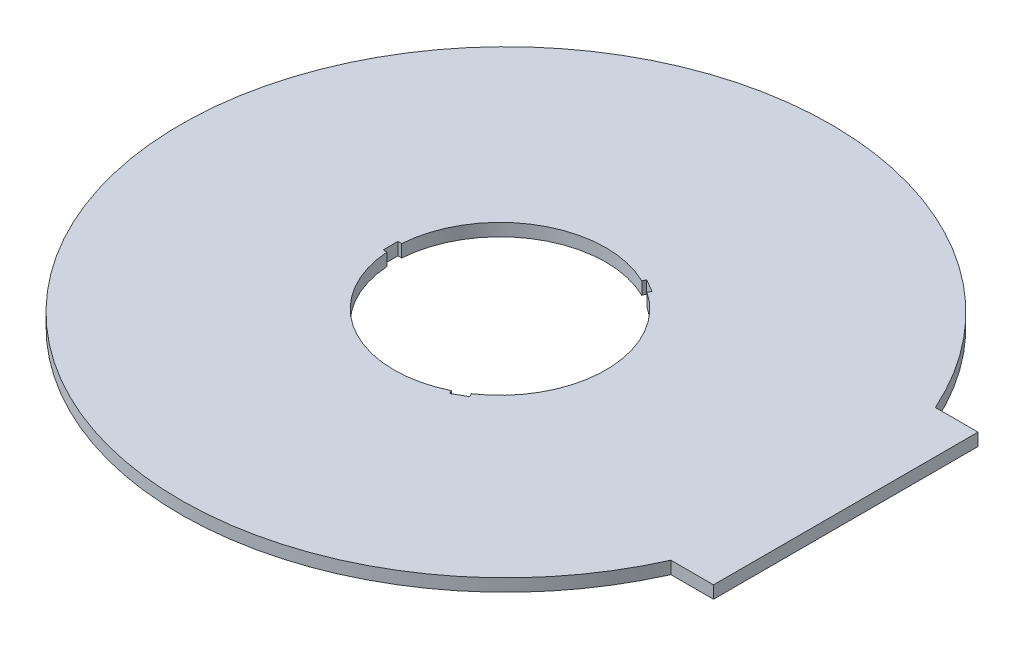
ISO-10303-21;
HEADER;
FILE_DESCRIPTION(('STEP AP214'),'2;1');
FILE_NAME('part.step','',(''),(''),'','','');
FILE_SCHEMA(('AUTOMOTIVE_DESIGN { 1 0 10303 214 1 1 1 1 }'));
ENDSEC;
DATA;
#1=APPLICATION_CONTEXT('core data for automotive mechanical design processes');
#2=APPLICATION_PROTOCOL_DEFINITION('international standard','automotive_design',2000,#1);
#3=PRODUCT_CONTEXT('',#1,'mechanical');
#4=PRODUCT('Part','Part','',(#3));
#5=PRODUCT_RELATED_PRODUCT_CATEGORY('part','',(#4));
#6=PRODUCT_DEFINITION_FORMATION('','',#4);
#7=PRODUCT_DEFINITION_CONTEXT('part definition',#1,'design');
#8=PRODUCT_DEFINITION('design','',#6,#7);
#9=PRODUCT_DEFINITION_SHAPE('','',#8);
#10=(LENGTH_UNIT() NAMED_UNIT(*) SI_UNIT(.MILLI.,.METRE.));
#11=(NAMED_UNIT(*) PLANE_ANGLE_UNIT() SI_UNIT($,.RADIAN.));
#12=(NAMED_UNIT(*) SI_UNIT($,.STERADIAN.) SOLID_ANGLE_UNIT());
#13=UNCERTAINTY_MEASURE_WITH_UNIT(LENGTH_MEASURE(1.E-05),#10,'distance_accuracy_value','');
#14=(GEOMETRIC_REPRESENTATION_CONTEXT(3) GLOBAL_UNCERTAINTY_ASSIGNED_CONTEXT((#13)) GLOBAL_UNIT_ASSIGNED_CONTEXT((#10,
#11,#12)) REPRESENTATION_CONTEXT('',''));
#15=CARTESIAN_POINT('',(0.,0.,0.));
#16=DIRECTION('',(0.,0.,1.));
#17=DIRECTION('',(1.,0.,0.));
#18=AXIS2_PLACEMENT_3D('',#15,#16,#17);
#19=CARTESIAN_POINT('',(116.376935977133,173.473960471824,91.1015697131829));
#20=DIRECTION('',(1.,0.,0.));
#21=DIRECTION('',(0.,0.,-1.));
#22=AXIS2_PLACEMENT_3D('',#19,#20,#21);
#23=PLANE('',#22);
#24=DIRECTION('',(0.,0.,-1.));
#25=VECTOR('',#24,1.);
#26=CARTESIAN_POINT('',(116.376935977133,174.999,91.1015697131829));
#27=LINE('',#26,#25);
#28=CARTESIAN_POINT('',(116.376935977133,174.999,91.1015697131829));
#29=VERTEX_POINT('',#28);
#30=CARTESIAN_POINT('',(116.376935977133,174.999,58.8984302868171));
#31=VERTEX_POINT('',#30);
#32=EDGE_CURVE('E266',#29,#31,#27,.T.);
#33=ORIENTED_EDGE('',*,*,#32,.F.);
#34=DIRECTION('',(0.,1.,0.));
#35=VECTOR('',#34,1.);
#36=CARTESIAN_POINT('',(116.376935977133,173.473960471824,91.1015697131829));
#37=LINE('',#36,#35);
#38=CARTESIAN_POINT('',(116.376935977133,173.473960471824,91.1015697131829));
#39=VERTEX_POINT('',#38);
#40=EDGE_CURVE('E35',#39,#29,#37,.T.);
#41=ORIENTED_EDGE('',*,*,#40,.F.);
#42=DIRECTION('',(0.,0.,-1.));
#43=VECTOR('',#42,1.);
#44=CARTESIAN_POINT('',(116.376935977133,173.473960471824,91.1015697131829));
#45=LINE('',#44,#43);
#46=CARTESIAN_POINT('',(116.376935977133,173.473960471824,58.8984302868171));
#47=VERTEX_POINT('',#46);
#48=EDGE_CURVE('E335',#39,#47,#45,.T.);
#49=ORIENTED_EDGE('',*,*,#48,.T.);
#50=DIRECTION('',(0.,1.,0.));
#51=VECTOR('',#50,1.);
#52=CARTESIAN_POINT('',(116.376935977133,173.473960471824,58.8984302868171));
#53=LINE('',#52,#51);
#54=EDGE_CURVE('E10',#47,#31,#53,.T.);
#55=ORIENTED_EDGE('',*,*,#54,.T.);
#56=EDGE_LOOP('',(#33,#41,#49,#55));
#57=FACE_BOUND('',#56,.T.);
#58=ADVANCED_FACE('F16',(#57),#23,.T.);
#59=CARTESIAN_POINT('',(116.376935977133,173.473960471824,58.8984302868171));
#60=DIRECTION('',(0.,0.,-1.));
#61=DIRECTION('',(-1.,0.,0.));
#62=AXIS2_PLACEMENT_3D('',#59,#60,#61);
#63=PLANE('',#62);
#64=DIRECTION('',(-1.,0.,0.));
#65=VECTOR('',#64,1.);
#66=CARTESIAN_POINT('',(116.376935977133,174.999,58.8984302868171));
#67=LINE('',#66,#65);
#68=CARTESIAN_POINT('',(111.187798908326,174.999,58.8984302868171));
#69=VERTEX_POINT('',#68);
#70=EDGE_CURVE('E269',#31,#69,#67,.T.);
#71=ORIENTED_EDGE('',*,*,#70,.F.);
#72=ORIENTED_EDGE('',*,*,#54,.F.);
#73=DIRECTION('',(-1.,0.,0.));
#74=VECTOR('',#73,1.);
#75=CARTESIAN_POINT('',(116.376935977133,173.473960471824,58.8984302868171));
#76=LINE('',#75,#74);
#77=CARTESIAN_POINT('',(111.187798908326,173.473960471824,58.8984302868171));
#78=VERTEX_POINT('',#77);
#79=EDGE_CURVE('E387',#47,#78,#76,.T.);
#80=ORIENTED_EDGE('',*,*,#79,.T.);
#81=DIRECTION('',(0.,1.,0.));
#82=VECTOR('',#81,1.);
#83=CARTESIAN_POINT('',(111.187798908326,173.473960471824,58.8984302868171));
#84=LINE('',#83,#82);
#85=EDGE_CURVE('E26',#78,#69,#84,.T.);
#86=ORIENTED_EDGE('',*,*,#85,.T.);
#87=EDGE_LOOP('',(#71,#72,#80,#86));
#88=FACE_BOUND('',#87,.T.);
#89=ADVANCED_FACE('F395',(#88),#63,.T.);
#90=CARTESIAN_POINT('',(110.457721302983,173.473960471824,60.));
#91=DIRECTION('',(-0.833549755446666,0.,-0.552444391042939));
#92=DIRECTION('',(-0.552444391042939,0.,0.833549755446666));
#93=AXIS2_PLACEMENT_3D('',#90,#91,#92);
#94=PLANE('',#93);
#95=DIRECTION('',(-0.552444391042939,0.,0.833549755446666));
#96=VECTOR('',#95,1.);
#97=CARTESIAN_POINT('',(110.457721302983,174.999,60.));
#98=LINE('',#97,#96);
#99=CARTESIAN_POINT('',(111.183392037478,174.999,58.9050795463208));
#100=VERTEX_POINT('',#99);
#101=EDGE_CURVE('E272',#69,#100,#98,.T.);
#102=ORIENTED_EDGE('',*,*,#101,.F.);
#103=ORIENTED_EDGE('',*,*,#85,.F.);
#104=DIRECTION('',(-0.552444391042939,0.,0.833549755446666));
#105=VECTOR('',#104,1.);
#106=CARTESIAN_POINT('',(110.457721302983,173.473960471824,60.));
#107=LINE('',#106,#105);
#108=CARTESIAN_POINT('',(111.183392037478,173.473960471824,58.9050795463208));
#109=VERTEX_POINT('',#108);
#110=EDGE_CURVE('E202',#78,#109,#107,.T.);
#111=ORIENTED_EDGE('',*,*,#110,.T.);
#112=DIRECTION('',(0.,1.,0.));
#113=VECTOR('',#112,1.);
#114=CARTESIAN_POINT('',(111.183392037478,173.473960471824,58.9050795463208));
#115=LINE('',#114,#113);
#116=EDGE_CURVE('E194',#109,#100,#115,.T.);
#117=ORIENTED_EDGE('',*,*,#116,.T.);
#118=EDGE_LOOP('',(#102,#103,#111,#117));
#119=FACE_BOUND('',#118,.T.);
#120=ADVANCED_FACE('F391',(#119),#94,.T.);
#121=CARTESIAN_POINT('',(75.,173.473960471824,75.));
#122=DIRECTION('',(0.,1.,0.));
#123=DIRECTION('',(0.,0.,1.));
#124=AXIS2_PLACEMENT_3D('',#121,#122,#123);
#125=CYLINDRICAL_SURFACE('',#124,39.6015697131829);
#126=CARTESIAN_POINT('',(75.,174.999,75.));
#127=DIRECTION('',(0.,1.,0.));
#128=DIRECTION('',(0.913685803354227,0.,-0.406421274970861));
#129=AXIS2_PLACEMENT_3D('',#126,#127,#128);
#130=CIRCLE('',#129,39.6015697131829);
#131=CARTESIAN_POINT('',(111.183392037478,174.999,91.0949204536792));
#132=VERTEX_POINT('',#131);
#133=EDGE_CURVE('E275',#100,#132,#130,.T.);
#134=ORIENTED_EDGE('',*,*,#133,.F.);
#135=ORIENTED_EDGE('',*,*,#116,.F.);
#136=CARTESIAN_POINT('',(75.,173.473960471824,75.));
#137=DIRECTION('',(0.,1.,0.));
#138=DIRECTION('',(0.913685803354227,0.,-0.406421274970861));
#139=AXIS2_PLACEMENT_3D('',#136,#137,#138);
#140=CIRCLE('',#139,39.6015697131829);
#141=CARTESIAN_POINT('',(111.183392037478,173.473960471824,91.0949204536792));
#142=VERTEX_POINT('',#141);
#143=EDGE_CURVE('E197',#109,#142,#140,.T.);
#144=ORIENTED_EDGE('',*,*,#143,.T.);
#145=DIRECTION('',(0.,1.,0.));
#146=VECTOR('',#145,1.);
#147=CARTESIAN_POINT('',(111.183392037478,173.473960471824,91.0949204536792));
#148=LINE('',#147,#146);
#149=EDGE_CURVE('E183',#142,#132,#148,.T.);
#150=ORIENTED_EDGE('',*,*,#149,.T.);
#151=EDGE_LOOP('',(#134,#135,#144,#150));
#152=FACE_BOUND('',#151,.T.);
#153=ADVANCED_FACE('F198',(#152),#125,.T.);
#154=CARTESIAN_POINT('',(111.187798908326,173.473960471824,91.1015697131829));
#155=DIRECTION('',(-0.833549755446668,0.,0.552444391042936));
#156=DIRECTION('',(0.552444391042936,0.,0.833549755446668));
#157=AXIS2_PLACEMENT_3D('',#154,#155,#156);
#158=PLANE('',#157);
#159=DIRECTION('',(0.552444391042936,0.,0.833549755446668));
#160=VECTOR('',#159,1.);
#161=CARTESIAN_POINT('',(111.187798908326,174.999,91.1015697131829));
#162=LINE('',#161,#160);
#163=CARTESIAN_POINT('',(111.187798908326,174.999,91.1015697131829));
#164=VERTEX_POINT('',#163);
#165=EDGE_CURVE('E190',#132,#164,#162,.T.);
#166=ORIENTED_EDGE('',*,*,#165,.F.);
#167=ORIENTED_EDGE('',*,*,#149,.F.);
#168=DIRECTION('',(0.552444391042936,0.,0.833549755446668));
#169=VECTOR('',#168,1.);
#170=CARTESIAN_POINT('',(111.187798908326,173.473960471824,91.1015697131829));
#171=LINE('',#170,#169);
#172=CARTESIAN_POINT('',(111.187798908326,173.473960471824,91.1015697131829));
#173=VERTEX_POINT('',#172);
#174=EDGE_CURVE('E187',#142,#173,#171,.T.);
#175=ORIENTED_EDGE('',*,*,#174,.T.);
#176=DIRECTION('',(0.,1.,0.));
#177=VECTOR('',#176,1.);
#178=CARTESIAN_POINT('',(111.187798908326,173.473960471824,91.1015697131829));
#179=LINE('',#178,#177);
#180=EDGE_CURVE('E111',#173,#164,#179,.T.);
#181=ORIENTED_EDGE('',*,*,#180,.T.);
#182=EDGE_LOOP('',(#166,#167,#175,#181));
#183=FACE_BOUND('',#182,.T.);
#184=ADVANCED_FACE('F185',(#183),#158,.T.);
#185=CARTESIAN_POINT('',(82.9356203017941,173.473960471824,86.0000000000012));
#186=DIRECTION('',(-0.188982236504611,0.,0.981980506061966));
#187=DIRECTION('',(0.981980506061966,0.,0.188982236504611));
#188=AXIS2_PLACEMENT_3D('',#185,#186,#187);
#189=PLANE('',#188);
#190=DIRECTION('',(0.981980506061966,0.,0.188982236504611));
#191=VECTOR('',#190,1.);
#192=CARTESIAN_POINT('',(82.9356203017941,174.999,86.0000000000012));
#193=LINE('',#192,#191);
#194=CARTESIAN_POINT('',(81.4555394138868,174.999,85.7151583003159));
#195=VERTEX_POINT('',#194);
#196=CARTESIAN_POINT('',(81.5046392683102,174.999,85.7246075717054));
#197=VERTEX_POINT('',#196);
#198=EDGE_CURVE('E212',#195,#197,#193,.T.);
#199=ORIENTED_EDGE('',*,*,#198,.F.);
#200=DIRECTION('',(0.,1.,0.));
#201=VECTOR('',#200,1.);
#202=CARTESIAN_POINT('',(81.4555394138868,173.473960471824,85.7151583003159));
#203=LINE('',#202,#201);
#204=CARTESIAN_POINT('',(81.4555394138868,173.473960471824,85.7151583003159));
#205=VERTEX_POINT('',#204);
#206=EDGE_CURVE('E208',#205,#195,#203,.T.);
#207=ORIENTED_EDGE('',*,*,#206,.F.);
#208=DIRECTION('',(0.981980506061966,0.,0.188982236504611));
#209=VECTOR('',#208,1.);
#210=CARTESIAN_POINT('',(82.9356203017941,173.473960471824,86.0000000000012));
#211=LINE('',#210,#209);
#212=CARTESIAN_POINT('',(81.5046392683102,173.473960471824,85.7246075717054));
#213=VERTEX_POINT('',#212);
#214=EDGE_CURVE('E280',#205,#213,#211,.T.);
#215=ORIENTED_EDGE('',*,*,#214,.T.);
#216=DIRECTION('',(0.,1.,0.));
#217=VECTOR('',#216,1.);
#218=CARTESIAN_POINT('',(81.5046392683102,173.473960471824,85.7246075717054));
#219=LINE('',#218,#217);
#220=EDGE_CURVE('E20',#213,#197,#219,.T.);
#221=ORIENTED_EDGE('',*,*,#220,.T.);
#222=EDGE_LOOP('',(#199,#207,#215,#221));
#223=FACE_BOUND('',#222,.T.);
#224=ADVANCED_FACE('F18',(#223),#189,.T.);
#225=CARTESIAN_POINT('',(81.5046392683102,173.473960471824,85.7246075717054));
#226=DIRECTION('',(-0.866025403784436,0.,0.500000000000004));
#227=DIRECTION('',(0.500000000000004,0.,0.866025403784436));
#228=AXIS2_PLACEMENT_3D('',#225,#226,#227);
#229=PLANE('',#228);
#230=DIRECTION('',(0.500000000000004,0.,0.866025403784436));
#231=VECTOR('',#230,1.);
#232=CARTESIAN_POINT('',(81.5046392683102,174.999,85.7246075717054));
#233=LINE('',#232,#231);
#234=CARTESIAN_POINT('',(81.7144273592702,174.999,86.087971204071));
#235=VERTEX_POINT('',#234);
#236=EDGE_CURVE('E215',#197,#235,#233,.T.);
#237=ORIENTED_EDGE('',*,*,#236,.F.);
#238=ORIENTED_EDGE('',*,*,#220,.F.);
#239=DIRECTION('',(0.500000000000004,0.,0.866025403784436));
#240=VECTOR('',#239,1.);
#241=CARTESIAN_POINT('',(81.5046392683102,173.473960471824,85.7246075717054));
#242=LINE('',#241,#240);
#243=CARTESIAN_POINT('',(81.7144273592702,173.473960471824,86.087971204071));
#244=VERTEX_POINT('',#243);
#245=EDGE_CURVE('E339',#213,#244,#242,.T.);
#246=ORIENTED_EDGE('',*,*,#245,.T.);
#247=DIRECTION('',(0.,1.,0.));
#248=VECTOR('',#247,1.);
#249=CARTESIAN_POINT('',(81.7144273592702,173.473960471824,86.087971204071));
#250=LINE('',#249,#248);
#251=EDGE_CURVE('E315',#244,#235,#250,.T.);
#252=ORIENTED_EDGE('',*,*,#251,.T.);
#253=EDGE_LOOP('',(#237,#238,#246,#252));
#254=FACE_BOUND('',#253,.T.);
#255=ADVANCED_FACE('F321',(#254),#229,.T.);
#256=CARTESIAN_POINT('',(81.7144273592702,173.473960471824,86.087971204071));
#257=DIRECTION('',(-0.499999999999994,0.,-0.866025403784442));
#258=DIRECTION('',(-0.866025403784442,0.,0.499999999999994));
#259=AXIS2_PLACEMENT_3D('',#256,#257,#258);
#260=PLANE('',#259);
#261=DIRECTION('',(-0.866025403784442,0.,0.499999999999994));
#262=VECTOR('',#261,1.);
#263=CARTESIAN_POINT('',(81.7144273592702,174.999,86.087971204071));
#264=LINE('',#263,#262);
#265=CARTESIAN_POINT('',(80.1583004554443,174.999,86.9864014908881));
#266=VERTEX_POINT('',#265);
#267=EDGE_CURVE('E218',#235,#266,#264,.T.);
#268=ORIENTED_EDGE('',*,*,#267,.F.);
#269=ORIENTED_EDGE('',*,*,#251,.F.);
#270=DIRECTION('',(-0.866025403784442,0.,0.499999999999994));
#271=VECTOR('',#270,1.);
#272=CARTESIAN_POINT('',(81.7144273592702,173.473960471824,86.087971204071));
#273=LINE('',#272,#271);
#274=CARTESIAN_POINT('',(80.1583004554443,173.473960471824,86.9864014908881));
#275=VERTEX_POINT('',#274);
#276=EDGE_CURVE('E341',#244,#275,#273,.T.);
#277=ORIENTED_EDGE('',*,*,#276,.T.);
#278=DIRECTION('',(0.,1.,0.));
#279=VECTOR('',#278,1.);
#280=CARTESIAN_POINT('',(80.1583004554443,173.473960471824,86.9864014908881));
#281=LINE('',#280,#279);
#282=EDGE_CURVE('E314',#275,#266,#281,.T.);
#283=ORIENTED_EDGE('',*,*,#282,.T.);
#284=EDGE_LOOP('',(#268,#269,#277,#283));
#285=FACE_BOUND('',#284,.T.);
#286=ADVANCED_FACE('F471',(#285),#260,.T.);
#287=CARTESIAN_POINT('',(80.1583004554443,173.473960471824,86.9864014908881));
#288=DIRECTION('',(0.866025403784436,0.,-0.500000000000004));
#289=DIRECTION('',(-0.500000000000004,0.,-0.866025403784436));
#290=AXIS2_PLACEMENT_3D('',#287,#288,#289);
#291=PLANE('',#290);
#292=DIRECTION('',(-0.500000000000004,0.,-0.866025403784436));
#293=VECTOR('',#292,1.);
#294=CARTESIAN_POINT('',(80.1583004554443,174.999,86.9864014908881));
#295=LINE('',#294,#293);
#296=CARTESIAN_POINT('',(79.9485123644843,174.999,86.6230378585225));
#297=VERTEX_POINT('',#296);
#298=EDGE_CURVE('E221',#266,#297,#295,.T.);
#299=ORIENTED_EDGE('',*,*,#298,.F.);
#300=ORIENTED_EDGE('',*,*,#282,.F.);
#301=DIRECTION('',(-0.500000000000004,0.,-0.866025403784436));
#302=VECTOR('',#301,1.);
#303=CARTESIAN_POINT('',(80.1583004554443,173.473960471824,86.9864014908881));
#304=LINE('',#303,#302);
#305=CARTESIAN_POINT('',(79.9485123644843,173.473960471824,86.6230378585225));
#306=VERTEX_POINT('',#305);
#307=EDGE_CURVE('E346',#275,#306,#304,.T.);
#308=ORIENTED_EDGE('',*,*,#307,.T.);
#309=DIRECTION('',(0.,1.,0.));
#310=VECTOR('',#309,1.);
#311=CARTESIAN_POINT('',(79.9485123644843,173.473960471824,86.6230378585225));
#312=LINE('',#311,#310);
#313=EDGE_CURVE('E312',#306,#297,#312,.T.);
#314=ORIENTED_EDGE('',*,*,#313,.T.);
#315=EDGE_LOOP('',(#299,#300,#308,#314));
#316=FACE_BOUND('',#315,.T.);
#317=ADVANCED_FACE('F467',(#316),#291,.T.);
#318=CARTESIAN_POINT('',(79.4715186866564,173.473960471824,88.0000000000012));
#319=DIRECTION('',(0.944911182523068,0.,0.327326835353989));
#320=DIRECTION('',(0.327326835353989,0.,-0.944911182523068));
#321=AXIS2_PLACEMENT_3D('',#318,#319,#320);
#322=PLANE('',#321);
#323=DIRECTION('',(0.327326835353989,0.,-0.944911182523068));
#324=VECTOR('',#323,1.);
#325=CARTESIAN_POINT('',(79.4715186866564,174.999,88.0000000000012));
#326=LINE('',#325,#324);
#327=CARTESIAN_POINT('',(79.9648789826255,174.999,86.5757915015749));
#328=VERTEX_POINT('',#327);
#329=EDGE_CURVE('E224',#297,#328,#326,.T.);
#330=ORIENTED_EDGE('',*,*,#329,.F.);
#331=ORIENTED_EDGE('',*,*,#313,.F.);
#332=DIRECTION('',(0.327326835353989,0.,-0.944911182523068));
#333=VECTOR('',#332,1.);
#334=CARTESIAN_POINT('',(79.4715186866564,173.473960471824,88.0000000000012));
#335=LINE('',#334,#333);
#336=CARTESIAN_POINT('',(79.9648789826255,173.473960471824,86.5757915015749));
#337=VERTEX_POINT('',#336);
#338=EDGE_CURVE('E349',#306,#337,#335,.T.);
#339=ORIENTED_EDGE('',*,*,#338,.T.);
#340=DIRECTION('',(0.,1.,0.));
#341=VECTOR('',#340,1.);
#342=CARTESIAN_POINT('',(79.9648789826255,173.473960471824,86.5757915015749));
#343=LINE('',#342,#341);
#344=EDGE_CURVE('E310',#337,#328,#343,.T.);
#345=ORIENTED_EDGE('',*,*,#344,.T.);
#346=EDGE_LOOP('',(#330,#331,#339,#345));
#347=FACE_BOUND('',#346,.T.);
#348=ADVANCED_FACE('F463',(#347),#322,.T.);
#349=CARTESIAN_POINT('',(74.2753662639497,173.473960471824,75.0000000000013));
#350=DIRECTION('',(0.,1.,0.));
#351=DIRECTION('',(0.,0.,1.));
#352=AXIS2_PLACEMENT_3D('',#349,#350,#351);
#353=CYLINDRICAL_SURFACE('',#352,12.898430286817);
#354=CARTESIAN_POINT('',(74.2753662639497,174.999,75.0000000000013));
#355=DIRECTION('',(0.,-1.,0.));
#356=DIRECTION('',(0.441101172170601,0.,0.89745738389615));
#357=AXIS2_PLACEMENT_3D('',#354,#355,#356);
#358=CIRCLE('',#357,12.898430286817);
#359=CARTESIAN_POINT('',(61.405680395337,174.999,75.8606332012602));
#360=VERTEX_POINT('',#359);
#361=EDGE_CURVE('E227',#328,#360,#358,.T.);
#362=ORIENTED_EDGE('',*,*,#361,.F.);
#363=ORIENTED_EDGE('',*,*,#344,.F.);
#364=CARTESIAN_POINT('',(74.2753662639497,173.473960471824,75.0000000000013));
#365=DIRECTION('',(0.,-1.,0.));
#366=DIRECTION('',(0.441101172170601,0.,0.89745738389615));
#367=AXIS2_PLACEMENT_3D('',#364,#365,#366);
#368=CIRCLE('',#367,12.898430286817);
#369=CARTESIAN_POINT('',(61.405680395337,173.473960471824,75.8606332012602));
#370=VERTEX_POINT('',#369);
#371=EDGE_CURVE('E352',#337,#370,#368,.T.);
#372=ORIENTED_EDGE('',*,*,#371,.T.);
#373=DIRECTION('',(0.,1.,0.));
#374=VECTOR('',#373,1.);
#375=CARTESIAN_POINT('',(61.405680395337,173.473960471824,75.8606332012602));
#376=LINE('',#375,#374);
#377=EDGE_CURVE('E308',#370,#360,#376,.T.);
#378=ORIENTED_EDGE('',*,*,#377,.T.);
#379=EDGE_LOOP('',(#362,#363,#372,#378));
#380=FACE_BOUND('',#379,.T.);
#381=ADVANCED_FACE('F459',(#380),#353,.F.);
#382=CARTESIAN_POINT('',(60.4189598033987,173.473960471824,77.0000000000012));
#383=DIRECTION('',(-0.755928946018452,0.,-0.65465367070798));
#384=DIRECTION('',(-0.65465367070798,0.,0.755928946018452));
#385=AXIS2_PLACEMENT_3D('',#382,#383,#384);
#386=PLANE('',#385);
#387=DIRECTION('',(-0.65465367070798,0.,0.755928946018452));
#388=VECTOR('',#387,1.);
#389=CARTESIAN_POINT('',(60.4189598033987,174.999,77.0000000000012));
#390=LINE('',#389,#388);
#391=CARTESIAN_POINT('',(61.3729471590546,174.999,75.8984302868183));
#392=VERTEX_POINT('',#391);
#393=EDGE_CURVE('E230',#360,#392,#390,.T.);
#394=ORIENTED_EDGE('',*,*,#393,.F.);
#395=ORIENTED_EDGE('',*,*,#377,.F.);
#396=DIRECTION('',(-0.65465367070798,0.,0.755928946018452));
#397=VECTOR('',#396,1.);
#398=CARTESIAN_POINT('',(60.4189598033987,173.473960471824,77.0000000000012));
#399=LINE('',#398,#397);
#400=CARTESIAN_POINT('',(61.3729471590546,173.473960471824,75.8984302868183));
#401=VERTEX_POINT('',#400);
#402=EDGE_CURVE('E355',#370,#401,#399,.T.);
#403=ORIENTED_EDGE('',*,*,#402,.T.);
#404=DIRECTION('',(0.,1.,0.));
#405=VECTOR('',#404,1.);
#406=CARTESIAN_POINT('',(61.3729471590546,173.473960471824,75.8984302868183));
#407=LINE('',#406,#405);
#408=EDGE_CURVE('E306',#401,#392,#407,.T.);
#409=ORIENTED_EDGE('',*,*,#408,.T.);
#410=EDGE_LOOP('',(#394,#395,#403,#409));
#411=FACE_BOUND('',#410,.T.);
#412=ADVANCED_FACE('F455',(#411),#386,.T.);
#413=CARTESIAN_POINT('',(61.3729471590546,173.473960471824,75.8984302868183));
#414=DIRECTION('',(0.,0.,-1.));
#415=DIRECTION('',(-1.,0.,0.));
#416=AXIS2_PLACEMENT_3D('',#413,#414,#415);
#417=PLANE('',#416);
#418=DIRECTION('',(-1.,0.,0.));
#419=VECTOR('',#418,1.);
#420=CARTESIAN_POINT('',(61.3729471590546,174.999,75.8984302868183));
#421=LINE('',#420,#419);
#422=CARTESIAN_POINT('',(60.9533709771345,174.999,75.8984302868183));
#423=VERTEX_POINT('',#422);
#424=EDGE_CURVE('E233',#392,#423,#421,.T.);
#425=ORIENTED_EDGE('',*,*,#424,.F.);
#426=ORIENTED_EDGE('',*,*,#408,.F.);
#427=DIRECTION('',(-1.,0.,0.));
#428=VECTOR('',#427,1.);
#429=CARTESIAN_POINT('',(61.3729471590546,173.473960471824,75.8984302868183));
#430=LINE('',#429,#428);
#431=CARTESIAN_POINT('',(60.9533709771345,173.473960471824,75.8984302868183));
#432=VERTEX_POINT('',#431);
#433=EDGE_CURVE('E358',#401,#432,#430,.T.);
#434=ORIENTED_EDGE('',*,*,#433,.T.);
#435=DIRECTION('',(0.,1.,0.));
#436=VECTOR('',#435,1.);
#437=CARTESIAN_POINT('',(60.9533709771345,173.473960471824,75.8984302868183));
#438=LINE('',#437,#436);
#439=EDGE_CURVE('E304',#432,#423,#438,.T.);
#440=ORIENTED_EDGE('',*,*,#439,.T.);
#441=EDGE_LOOP('',(#425,#426,#434,#440));
#442=FACE_BOUND('',#441,.T.);
#443=ADVANCED_FACE('F451',(#442),#417,.T.);
#444=CARTESIAN_POINT('',(60.9533709771345,173.473960471824,75.8984302868183));
#445=DIRECTION('',(1.,0.,0.));
#446=DIRECTION('',(0.,0.,-1.));
#447=AXIS2_PLACEMENT_3D('',#444,#445,#446);
#448=PLANE('',#447);
#449=DIRECTION('',(0.,0.,-1.));
#450=VECTOR('',#449,1.);
#451=CARTESIAN_POINT('',(60.9533709771345,174.999,75.8984302868183));
#452=LINE('',#451,#450);
#453=CARTESIAN_POINT('',(60.9533709771345,174.999,74.1015697131842));
#454=VERTEX_POINT('',#453);
#455=EDGE_CURVE('E236',#423,#454,#452,.T.);
#456=ORIENTED_EDGE('',*,*,#455,.F.);
#457=ORIENTED_EDGE('',*,*,#439,.F.);
#458=DIRECTION('',(0.,0.,-1.));
#459=VECTOR('',#458,1.);
#460=CARTESIAN_POINT('',(60.9533709771345,173.473960471824,75.8984302868183));
#461=LINE('',#460,#459);
#462=CARTESIAN_POINT('',(60.9533709771345,173.473960471824,74.1015697131842));
#463=VERTEX_POINT('',#462);
#464=EDGE_CURVE('E361',#432,#463,#461,.T.);
#465=ORIENTED_EDGE('',*,*,#464,.T.);
#466=DIRECTION('',(0.,1.,0.));
#467=VECTOR('',#466,1.);
#468=CARTESIAN_POINT('',(60.9533709771345,173.473960471824,74.1015697131842));
#469=LINE('',#468,#467);
#470=EDGE_CURVE('E302',#463,#454,#469,.T.);
#471=ORIENTED_EDGE('',*,*,#470,.T.);
#472=EDGE_LOOP('',(#456,#457,#465,#471));
#473=FACE_BOUND('',#472,.T.);
#474=ADVANCED_FACE('F447',(#473),#448,.T.);
#475=CARTESIAN_POINT('',(60.9533709771345,173.473960471824,74.1015697131842));
#476=DIRECTION('',(0.,0.,1.));
#477=DIRECTION('',(1.,0.,0.));
#478=AXIS2_PLACEMENT_3D('',#475,#476,#477);
#479=PLANE('',#478);
#480=DIRECTION('',(1.,0.,0.));
#481=VECTOR('',#480,1.);
#482=CARTESIAN_POINT('',(60.9533709771345,174.999,74.1015697131842));
#483=LINE('',#482,#481);
#484=CARTESIAN_POINT('',(61.3729471590546,174.999,74.1015697131842));
#485=VERTEX_POINT('',#484);
#486=EDGE_CURVE('E239',#454,#485,#483,.T.);
#487=ORIENTED_EDGE('',*,*,#486,.F.);
#488=ORIENTED_EDGE('',*,*,#470,.F.);
#489=DIRECTION('',(1.,0.,0.));
#490=VECTOR('',#489,1.);
#491=CARTESIAN_POINT('',(60.9533709771345,173.473960471824,74.1015697131842));
#492=LINE('',#491,#490);
#493=CARTESIAN_POINT('',(61.3729471590546,173.473960471824,74.1015697131842));
#494=VERTEX_POINT('',#493);
#495=EDGE_CURVE('E364',#463,#494,#492,.T.);
#496=ORIENTED_EDGE('',*,*,#495,.T.);
#497=DIRECTION('',(0.,1.,0.));
#498=VECTOR('',#497,1.);
#499=CARTESIAN_POINT('',(61.3729471590546,173.473960471824,74.1015697131842));
#500=LINE('',#499,#498);
#501=EDGE_CURVE('E300',#494,#485,#500,.T.);
#502=ORIENTED_EDGE('',*,*,#501,.T.);
#503=EDGE_LOOP('',(#487,#488,#496,#502));
#504=FACE_BOUND('',#503,.T.);
#505=ADVANCED_FACE('F443',(#504),#479,.T.);
#506=CARTESIAN_POINT('',(60.4189598033987,173.473960471824,73.0000000000013));
#507=DIRECTION('',(-0.755928946018455,0.,0.654653670707976));
#508=DIRECTION('',(0.654653670707976,0.,0.755928946018455));
#509=AXIS2_PLACEMENT_3D('',#506,#507,#508);
#510=PLANE('',#509);
#511=DIRECTION('',(0.654653670707976,0.,0.755928946018455));
#512=VECTOR('',#511,1.);
#513=CARTESIAN_POINT('',(60.4189598033987,174.999,73.0000000000013));
#514=LINE('',#513,#512);
#515=CARTESIAN_POINT('',(61.405680395337,174.999,74.1393667987423));
#516=VERTEX_POINT('',#515);
#517=EDGE_CURVE('E242',#485,#516,#514,.T.);
#518=ORIENTED_EDGE('',*,*,#517,.F.);
#519=ORIENTED_EDGE('',*,*,#501,.F.);
#520=DIRECTION('',(0.654653670707976,0.,0.755928946018455));
#521=VECTOR('',#520,1.);
#522=CARTESIAN_POINT('',(60.4189598033987,173.473960471824,73.0000000000013));
#523=LINE('',#522,#521);
#524=CARTESIAN_POINT('',(61.405680395337,173.473960471824,74.1393667987423));
#525=VERTEX_POINT('',#524);
#526=EDGE_CURVE('E367',#494,#525,#523,.T.);
#527=ORIENTED_EDGE('',*,*,#526,.T.);
#528=DIRECTION('',(0.,1.,0.));
#529=VECTOR('',#528,1.);
#530=CARTESIAN_POINT('',(61.405680395337,173.473960471824,74.1393667987423));
#531=LINE('',#530,#529);
#532=EDGE_CURVE('E298',#525,#516,#531,.T.);
#533=ORIENTED_EDGE('',*,*,#532,.T.);
#534=EDGE_LOOP('',(#518,#519,#527,#533));
#535=FACE_BOUND('',#534,.T.);
#536=ADVANCED_FACE('F439',(#535),#510,.T.);
#537=CARTESIAN_POINT('',(74.2753662639497,173.473960471824,75.0000000000013));
#538=DIRECTION('',(0.,1.,0.));
#539=DIRECTION('',(0.,0.,1.));
#540=AXIS2_PLACEMENT_3D('',#537,#538,#539);
#541=CYLINDRICAL_SURFACE('',#540,12.8984302868171);
#542=CARTESIAN_POINT('',(74.2753662639497,174.999,75.0000000000013));
#543=DIRECTION('',(0.,-1.,0.));
#544=DIRECTION('',(-0.99777147935329,0.,-0.0667238712092419));
#545=AXIS2_PLACEMENT_3D('',#542,#543,#544);
#546=CIRCLE('',#545,12.8984302868171);
#547=CARTESIAN_POINT('',(79.9648789826254,174.999,63.4242084984275));
#548=VERTEX_POINT('',#547);
#549=EDGE_CURVE('E245',#516,#548,#546,.T.);
#550=ORIENTED_EDGE('',*,*,#549,.F.);
#551=ORIENTED_EDGE('',*,*,#532,.F.);
#552=CARTESIAN_POINT('',(74.2753662639497,173.473960471824,75.0000000000013));
#553=DIRECTION('',(0.,-1.,0.));
#554=DIRECTION('',(-0.99777147935329,0.,-0.0667238712092419));
#555=AXIS2_PLACEMENT_3D('',#552,#553,#554);
#556=CIRCLE('',#555,12.8984302868171);
#557=CARTESIAN_POINT('',(79.9648789826254,173.473960471824,63.4242084984275));
#558=VERTEX_POINT('',#557);
#559=EDGE_CURVE('E370',#525,#558,#556,.T.);
#560=ORIENTED_EDGE('',*,*,#559,.T.);
#561=DIRECTION('',(0.,1.,0.));
#562=VECTOR('',#561,1.);
#563=CARTESIAN_POINT('',(79.9648789826254,173.473960471824,63.4242084984275));
#564=LINE('',#563,#562);
#565=EDGE_CURVE('E296',#558,#548,#564,.T.);
#566=ORIENTED_EDGE('',*,*,#565,.T.);
#567=EDGE_LOOP('',(#550,#551,#560,#566));
#568=FACE_BOUND('',#567,.T.);
#569=ADVANCED_FACE('F435',(#568),#541,.F.);
#570=CARTESIAN_POINT('',(79.4715186866562,173.473960471824,62.0000000000012));
#571=DIRECTION('',(0.944911182523067,0.,-0.327326835353992));
#572=DIRECTION('',(-0.327326835353992,0.,-0.944911182523067));
#573=AXIS2_PLACEMENT_3D('',#570,#571,#572);
#574=PLANE('',#573);
#575=DIRECTION('',(-0.327326835353992,0.,-0.944911182523067));
#576=VECTOR('',#575,1.);
#577=CARTESIAN_POINT('',(79.4715186866562,174.999,62.0000000000012));
#578=LINE('',#577,#576);
#579=CARTESIAN_POINT('',(79.9485123644842,174.999,63.3769621414799));
#580=VERTEX_POINT('',#579);
#581=EDGE_CURVE('E248',#548,#580,#578,.T.);
#582=ORIENTED_EDGE('',*,*,#581,.F.);
#583=ORIENTED_EDGE('',*,*,#565,.F.);
#584=DIRECTION('',(-0.327326835353992,0.,-0.944911182523067));
#585=VECTOR('',#584,1.);
#586=CARTESIAN_POINT('',(79.4715186866562,173.473960471824,62.0000000000012));
#587=LINE('',#586,#585);
#588=CARTESIAN_POINT('',(79.9485123644842,173.473960471824,63.3769621414799));
#589=VERTEX_POINT('',#588);
#590=EDGE_CURVE('E373',#558,#589,#587,.T.);
#591=ORIENTED_EDGE('',*,*,#590,.T.);
#592=DIRECTION('',(0.,1.,0.));
#593=VECTOR('',#592,1.);
#594=CARTESIAN_POINT('',(79.9485123644842,173.473960471824,63.3769621414799));
#595=LINE('',#594,#593);
#596=EDGE_CURVE('E294',#589,#580,#595,.T.);
#597=ORIENTED_EDGE('',*,*,#596,.T.);
#598=EDGE_LOOP('',(#582,#583,#591,#597));
#599=FACE_BOUND('',#598,.T.);
#600=ADVANCED_FACE('F431',(#599),#574,.T.);
#601=CARTESIAN_POINT('',(79.9485123644842,173.473960471824,63.3769621414799));
#602=DIRECTION('',(0.866025403784443,0.,0.499999999999992));
#603=DIRECTION('',(0.499999999999992,0.,-0.866025403784443));
#604=AXIS2_PLACEMENT_3D('',#601,#602,#603);
#605=PLANE('',#604);
#606=DIRECTION('',(0.499999999999992,0.,-0.866025403784443));
#607=VECTOR('',#606,1.);
#608=CARTESIAN_POINT('',(79.9485123644842,174.999,63.3769621414799));
#609=LINE('',#608,#607);
#610=CARTESIAN_POINT('',(80.1583004554445,174.999,63.0135985091138));
#611=VERTEX_POINT('',#610);
#612=EDGE_CURVE('E251',#580,#611,#609,.T.);
#613=ORIENTED_EDGE('',*,*,#612,.F.);
#614=ORIENTED_EDGE('',*,*,#596,.F.);
#615=DIRECTION('',(0.499999999999992,0.,-0.866025403784443));
#616=VECTOR('',#615,1.);
#617=CARTESIAN_POINT('',(79.9485123644842,173.473960471824,63.3769621414799));
#618=LINE('',#617,#616);
#619=CARTESIAN_POINT('',(80.1583004554445,173.473960471824,63.0135985091138));
#620=VERTEX_POINT('',#619);
#621=EDGE_CURVE('E376',#589,#620,#618,.T.);
#622=ORIENTED_EDGE('',*,*,#621,.T.);
#623=DIRECTION('',(0.,1.,0.));
#624=VECTOR('',#623,1.);
#625=CARTESIAN_POINT('',(80.1583004554445,173.473960471824,63.0135985091138));
#626=LINE('',#625,#624);
#627=EDGE_CURVE('E292',#620,#611,#626,.T.);
#628=ORIENTED_EDGE('',*,*,#627,.T.);
#629=EDGE_LOOP('',(#613,#614,#622,#628));
#630=FACE_BOUND('',#629,.T.);
#631=ADVANCED_FACE('F427',(#630),#605,.T.);
#632=CARTESIAN_POINT('',(80.1583004554445,173.473960471824,63.0135985091138));
#633=DIRECTION('',(-0.500000000000002,0.,0.866025403784437));
#634=DIRECTION('',(0.866025403784438,0.,0.500000000000002));
#635=AXIS2_PLACEMENT_3D('',#632,#633,#634);
#636=PLANE('',#635);
#637=DIRECTION('',(0.866025403784437,0.,0.500000000000002));
#638=VECTOR('',#637,1.);
#639=CARTESIAN_POINT('',(80.1583004554445,174.999,63.0135985091138));
#640=LINE('',#639,#638);
#641=CARTESIAN_POINT('',(81.7144273592703,174.999,63.912028795931));
#642=VERTEX_POINT('',#641);
#643=EDGE_CURVE('E254',#611,#642,#640,.T.);
#644=ORIENTED_EDGE('',*,*,#643,.F.);
#645=ORIENTED_EDGE('',*,*,#627,.F.);
#646=DIRECTION('',(0.866025403784437,0.,0.500000000000002));
#647=VECTOR('',#646,1.);
#648=CARTESIAN_POINT('',(80.1583004554445,173.473960471824,63.0135985091138));
#649=LINE('',#648,#647);
#650=CARTESIAN_POINT('',(81.7144273592703,173.473960471824,63.912028795931));
#651=VERTEX_POINT('',#650);
#652=EDGE_CURVE('E379',#620,#651,#649,.T.);
#653=ORIENTED_EDGE('',*,*,#652,.T.);
#654=DIRECTION('',(0.,1.,0.));
#655=VECTOR('',#654,1.);
#656=CARTESIAN_POINT('',(81.7144273592703,173.473960471824,63.912028795931));
#657=LINE('',#656,#655);
#658=EDGE_CURVE('E290',#651,#642,#657,.T.);
#659=ORIENTED_EDGE('',*,*,#658,.T.);
#660=EDGE_LOOP('',(#644,#645,#653,#659));
#661=FACE_BOUND('',#660,.T.);
#662=ADVANCED_FACE('F423',(#661),#636,.T.);
#663=CARTESIAN_POINT('',(81.7144273592703,173.473960471824,63.912028795931));
#664=DIRECTION('',(-0.866025403784443,0.,-0.499999999999992));
#665=DIRECTION('',(-0.499999999999992,0.,0.866025403784443));
#666=AXIS2_PLACEMENT_3D('',#663,#664,#665);
#667=PLANE('',#666);
#668=DIRECTION('',(-0.499999999999992,0.,0.866025403784443));
#669=VECTOR('',#668,1.);
#670=CARTESIAN_POINT('',(81.7144273592703,174.999,63.912028795931));
#671=LINE('',#670,#669);
#672=CARTESIAN_POINT('',(81.5046392683101,174.999,64.2753924282969));
#673=VERTEX_POINT('',#672);
#674=EDGE_CURVE('E257',#642,#673,#671,.T.);
#675=ORIENTED_EDGE('',*,*,#674,.F.);
#676=ORIENTED_EDGE('',*,*,#658,.F.);
#677=DIRECTION('',(-0.499999999999992,0.,0.866025403784443));
#678=VECTOR('',#677,1.);
#679=CARTESIAN_POINT('',(81.7144273592703,173.473960471824,63.912028795931));
#680=LINE('',#679,#678);
#681=CARTESIAN_POINT('',(81.5046392683101,173.473960471824,64.2753924282969));
#682=VERTEX_POINT('',#681);
#683=EDGE_CURVE('E382',#651,#682,#680,.T.);
#684=ORIENTED_EDGE('',*,*,#683,.T.);
#685=DIRECTION('',(0.,1.,0.));
#686=VECTOR('',#685,1.);
#687=CARTESIAN_POINT('',(81.5046392683101,173.473960471824,64.2753924282969));
#688=LINE('',#687,#686);
#689=EDGE_CURVE('E288',#682,#673,#688,.T.);
#690=ORIENTED_EDGE('',*,*,#689,.T.);
#691=EDGE_LOOP('',(#675,#676,#684,#690));
#692=FACE_BOUND('',#691,.T.);
#693=ADVANCED_FACE('F419',(#692),#667,.T.);
#694=CARTESIAN_POINT('',(82.935620301794,173.473960471824,64.0000000000012));
#695=DIRECTION('',(-0.188982236504617,0.,-0.981980506061965));
#696=DIRECTION('',(-0.981980506061965,0.,0.188982236504617));
#697=AXIS2_PLACEMENT_3D('',#694,#695,#696);
#698=PLANE('',#697);
#699=DIRECTION('',(-0.981980506061965,0.,0.188982236504617));
#700=VECTOR('',#699,1.);
#701=CARTESIAN_POINT('',(82.935620301794,174.999,64.0000000000012));
#702=LINE('',#701,#700);
#703=CARTESIAN_POINT('',(81.4555394138866,174.999,64.2848416996864));
#704=VERTEX_POINT('',#703);
#705=EDGE_CURVE('E260',#673,#704,#702,.T.);
#706=ORIENTED_EDGE('',*,*,#705,.F.);
#707=ORIENTED_EDGE('',*,*,#689,.F.);
#708=DIRECTION('',(-0.981980506061965,0.,0.188982236504617));
#709=VECTOR('',#708,1.);
#710=CARTESIAN_POINT('',(82.935620301794,173.473960471824,64.0000000000012));
#711=LINE('',#710,#709);
#712=CARTESIAN_POINT('',(81.4555394138866,173.473960471824,64.2848416996864));
#713=VERTEX_POINT('',#712);
#714=EDGE_CURVE('E336',#682,#713,#711,.T.);
#715=ORIENTED_EDGE('',*,*,#714,.T.);
#716=DIRECTION('',(0.,1.,0.));
#717=VECTOR('',#716,1.);
#718=CARTESIAN_POINT('',(81.4555394138866,173.473960471824,64.2848416996864));
#719=LINE('',#718,#717);
#720=EDGE_CURVE('E286',#713,#704,#719,.T.);
#721=ORIENTED_EDGE('',*,*,#720,.T.);
#722=EDGE_LOOP('',(#706,#707,#715,#721));
#723=FACE_BOUND('',#722,.T.);
#724=ADVANCED_FACE('F405',(#723),#698,.T.);
#725=CARTESIAN_POINT('',(74.2753662639497,173.473960471824,75.0000000000013));
#726=DIRECTION('',(0.,1.,0.));
#727=DIRECTION('',(0.,0.,1.));
#728=AXIS2_PLACEMENT_3D('',#725,#726,#727);
#729=CYLINDRICAL_SURFACE('',#728,12.8984302868171);
#730=CARTESIAN_POINT('',(74.2753662639497,174.999,75.0000000000013));
#731=DIRECTION('',(0.,-1.,0.));
#732=DIRECTION('',(0.556670307182681,0.,-0.830733512686914));
#733=AXIS2_PLACEMENT_3D('',#730,#731,#732);
#734=CIRCLE('',#733,12.8984302868171);
#735=EDGE_CURVE('E263',#704,#195,#734,.T.);
#736=ORIENTED_EDGE('',*,*,#735,.F.);
#737=ORIENTED_EDGE('',*,*,#720,.F.);
#738=CARTESIAN_POINT('',(74.2753662639497,173.473960471824,75.0000000000013));
#739=DIRECTION('',(0.,-1.,0.));
#740=DIRECTION('',(0.556670307182681,0.,-0.830733512686914));
#741=AXIS2_PLACEMENT_3D('',#738,#739,#740);
#742=CIRCLE('',#741,12.8984302868171);
#743=EDGE_CURVE('E332',#713,#205,#742,.T.);
#744=ORIENTED_EDGE('',*,*,#743,.T.);
#745=ORIENTED_EDGE('',*,*,#206,.T.);
#746=EDGE_LOOP('',(#736,#737,#744,#745));
#747=FACE_BOUND('',#746,.T.);
#748=ADVANCED_FACE('F328',(#747),#729,.F.);
#749=CARTESIAN_POINT('',(111.187798908326,173.473960471824,91.1015697131829));
#750=DIRECTION('',(0.,0.,1.));
#751=DIRECTION('',(1.,0.,0.));
#752=AXIS2_PLACEMENT_3D('',#749,#750,#751);
#753=PLANE('',#752);
#754=DIRECTION('',(1.,0.,0.));
#755=VECTOR('',#754,1.);
#756=CARTESIAN_POINT('',(111.187798908326,174.999,91.1015697131829));
#757=LINE('',#756,#755);
#758=EDGE_CURVE('E278',#164,#29,#757,.T.);
#759=ORIENTED_EDGE('',*,*,#758,.F.);
#760=ORIENTED_EDGE('',*,*,#180,.F.);
#761=DIRECTION('',(1.,0.,0.));
#762=VECTOR('',#761,1.);
#763=CARTESIAN_POINT('',(111.187798908326,173.473960471824,91.1015697131829));
#764=LINE('',#763,#762);
#765=EDGE_CURVE('E206',#173,#39,#764,.T.);
#766=ORIENTED_EDGE('',*,*,#765,.T.);
#767=ORIENTED_EDGE('',*,*,#40,.T.);
#768=EDGE_LOOP('',(#759,#760,#766,#767));
#769=FACE_BOUND('',#768,.T.);
#770=ADVANCED_FACE('F396',(#769),#753,.T.);
#771=CARTESIAN_POINT('',(36.5,173.473960471824,75.));
#772=DIRECTION('',(0.,1.,0.));
#773=DIRECTION('',(-1.,0.,0.));
#774=AXIS2_PLACEMENT_3D('',#771,#772,#773);
#775=PLANE('',#774);
#776=ORIENTED_EDGE('',*,*,#214,.F.);
#777=ORIENTED_EDGE('',*,*,#743,.F.);
#778=ORIENTED_EDGE('',*,*,#714,.F.);
#779=ORIENTED_EDGE('',*,*,#683,.F.);
#780=ORIENTED_EDGE('',*,*,#652,.F.);
#781=ORIENTED_EDGE('',*,*,#621,.F.);
#782=ORIENTED_EDGE('',*,*,#590,.F.);
#783=ORIENTED_EDGE('',*,*,#559,.F.);
#784=ORIENTED_EDGE('',*,*,#526,.F.);
#785=ORIENTED_EDGE('',*,*,#495,.F.);
#786=ORIENTED_EDGE('',*,*,#464,.F.);
#787=ORIENTED_EDGE('',*,*,#433,.F.);
#788=ORIENTED_EDGE('',*,*,#402,.F.);
#789=ORIENTED_EDGE('',*,*,#371,.F.);
#790=ORIENTED_EDGE('',*,*,#338,.F.);
#791=ORIENTED_EDGE('',*,*,#307,.F.);
#792=ORIENTED_EDGE('',*,*,#276,.F.);
#793=ORIENTED_EDGE('',*,*,#245,.F.);
#794=EDGE_LOOP('',(#776,#777,#778,#779,#780,#781,#782,#783,#784,#785,#786,#787,#788,#789,#790,
#791,#792,#793));
#795=FACE_BOUND('',#794,.T.);
#796=ORIENTED_EDGE('',*,*,#48,.F.);
#797=ORIENTED_EDGE('',*,*,#765,.F.);
#798=ORIENTED_EDGE('',*,*,#174,.F.);
#799=ORIENTED_EDGE('',*,*,#143,.F.);
#800=ORIENTED_EDGE('',*,*,#110,.F.);
#801=ORIENTED_EDGE('',*,*,#79,.F.);
#802=EDGE_LOOP('',(#796,#797,#798,#799,#800,#801));
#803=FACE_BOUND('',#802,.T.);
#804=ADVANCED_FACE('F205',(#795,#803),#775,.F.);
#805=CARTESIAN_POINT('',(36.5,174.999,75.));
#806=DIRECTION('',(0.,1.,0.));
#807=DIRECTION('',(-1.,0.,0.));
#808=AXIS2_PLACEMENT_3D('',#805,#806,#807);
#809=PLANE('',#808);
#810=ORIENTED_EDGE('',*,*,#198,.T.);
#811=ORIENTED_EDGE('',*,*,#236,.T.);
#812=ORIENTED_EDGE('',*,*,#267,.T.);
#813=ORIENTED_EDGE('',*,*,#298,.T.);
#814=ORIENTED_EDGE('',*,*,#329,.T.);
#815=ORIENTED_EDGE('',*,*,#361,.T.);
#816=ORIENTED_EDGE('',*,*,#393,.T.);
#817=ORIENTED_EDGE('',*,*,#424,.T.);
#818=ORIENTED_EDGE('',*,*,#455,.T.);
#819=ORIENTED_EDGE('',*,*,#486,.T.);
#820=ORIENTED_EDGE('',*,*,#517,.T.);
#821=ORIENTED_EDGE('',*,*,#549,.T.);
#822=ORIENTED_EDGE('',*,*,#581,.T.);
#823=ORIENTED_EDGE('',*,*,#612,.T.);
#824=ORIENTED_EDGE('',*,*,#643,.T.);
#825=ORIENTED_EDGE('',*,*,#674,.T.);
#826=ORIENTED_EDGE('',*,*,#705,.T.);
#827=ORIENTED_EDGE('',*,*,#735,.T.);
#828=EDGE_LOOP('',(#810,#811,#812,#813,#814,#815,#816,#817,#818,#819,#820,#821,#822,#823,#824,
#825,#826,#827));
#829=FACE_BOUND('',#828,.T.);
#830=ORIENTED_EDGE('',*,*,#32,.T.);
#831=ORIENTED_EDGE('',*,*,#70,.T.);
#832=ORIENTED_EDGE('',*,*,#101,.T.);
#833=ORIENTED_EDGE('',*,*,#133,.T.);
#834=ORIENTED_EDGE('',*,*,#165,.T.);
#835=ORIENTED_EDGE('',*,*,#758,.T.);
#836=EDGE_LOOP('',(#830,#831,#832,#833,#834,#835));
#837=FACE_BOUND('',#836,.T.);
#838=ADVANCED_FACE('F323',(#829,#837),#809,.T.);
#839=CLOSED_SHELL('',(#58,#89,#120,#153,#184,#224,#255,#286,#317,#348,#381,#412,#443,#474,#505,
#536,#569,#600,#631,#662,#693,#724,#748,#770,#804,#838));
#840=MANIFOLD_SOLID_BREP('B1',#839);
#841=ADVANCED_BREP_SHAPE_REPRESENTATION('',(#18,#840),#14);
#842=SHAPE_DEFINITION_REPRESENTATION(#9,#841);
ENDSEC;
END-ISO-10303-21;
